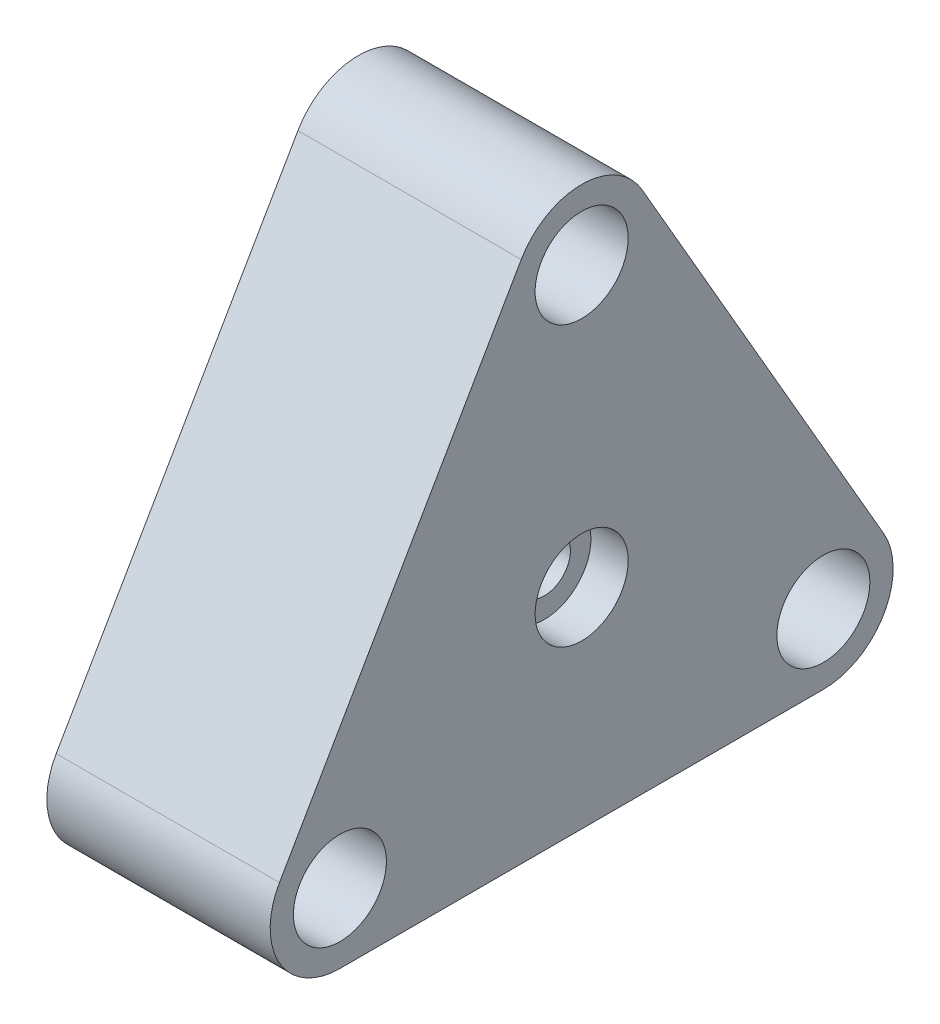
ISO-10303-21;
HEADER;
FILE_DESCRIPTION(('STEP AP214'),'2;1');
FILE_NAME('part.step','',(''),(''),'','','');
FILE_SCHEMA(('AUTOMOTIVE_DESIGN { 1 0 10303 214 1 1 1 1 }'));
ENDSEC;
DATA;
#1=APPLICATION_CONTEXT('core data for automotive mechanical design processes');
#2=APPLICATION_PROTOCOL_DEFINITION('international standard','automotive_design',2000,#1);
#3=PRODUCT_CONTEXT('',#1,'mechanical');
#4=PRODUCT('Part','Part','',(#3));
#5=PRODUCT_RELATED_PRODUCT_CATEGORY('part','',(#4));
#6=PRODUCT_DEFINITION_FORMATION('','',#4);
#7=PRODUCT_DEFINITION_CONTEXT('part definition',#1,'design');
#8=PRODUCT_DEFINITION('design','',#6,#7);
#9=PRODUCT_DEFINITION_SHAPE('','',#8);
#10=(LENGTH_UNIT() NAMED_UNIT(*) SI_UNIT(.MILLI.,.METRE.));
#11=(NAMED_UNIT(*) PLANE_ANGLE_UNIT() SI_UNIT($,.RADIAN.));
#12=(NAMED_UNIT(*) SI_UNIT($,.STERADIAN.) SOLID_ANGLE_UNIT());
#13=UNCERTAINTY_MEASURE_WITH_UNIT(LENGTH_MEASURE(1.E-05),#10,'distance_accuracy_value','');
#14=(GEOMETRIC_REPRESENTATION_CONTEXT(3) GLOBAL_UNCERTAINTY_ASSIGNED_CONTEXT((#13)) GLOBAL_UNIT_ASSIGNED_CONTEXT((#10,
#11,#12)) REPRESENTATION_CONTEXT('',''));
#15=CARTESIAN_POINT('',(0.,0.,0.));
#16=DIRECTION('',(0.,0.,1.));
#17=DIRECTION('',(1.,0.,0.));
#18=AXIS2_PLACEMENT_3D('',#15,#16,#17);
#19=CARTESIAN_POINT('',(0.,0.,0.));
#20=DIRECTION('',(-1.,0.,0.));
#21=DIRECTION('',(0.,0.,1.));
#22=AXIS2_PLACEMENT_3D('',#19,#20,#21);
#23=CYLINDRICAL_SURFACE('',#22,1.397);
#24=CARTESIAN_POINT('',(0.,0.,0.));
#25=DIRECTION('',(-1.,0.,0.));
#26=DIRECTION('',(0.,0.,1.));
#27=AXIS2_PLACEMENT_3D('',#24,#25,#26);
#28=CIRCLE('',#27,1.397);
#29=CARTESIAN_POINT('',(0.,0.,1.397));
#30=VERTEX_POINT('',#29);
#31=EDGE_CURVE('E179',#30,#30,#28,.T.);
#32=ORIENTED_EDGE('',*,*,#31,.T.);
#33=EDGE_LOOP('',(#32));
#34=FACE_BOUND('',#33,.T.);
#35=CARTESIAN_POINT('',(4.,0.,0.));
#36=DIRECTION('',(1.,0.,0.));
#37=DIRECTION('',(0.,0.,-1.));
#38=AXIS2_PLACEMENT_3D('',#35,#36,#37);
#39=CIRCLE('',#38,1.397);
#40=CARTESIAN_POINT('',(4.,0.,-1.397));
#41=VERTEX_POINT('',#40);
#42=EDGE_CURVE('E53',#41,#41,#39,.F.);
#43=ORIENTED_EDGE('',*,*,#42,.F.);
#44=EDGE_LOOP('',(#43));
#45=FACE_BOUND('',#44,.T.);
#46=ADVANCED_FACE('F49',(#34,#45),#23,.F.);
#47=CARTESIAN_POINT('',(0.,-7.49999999999997,12.9903810567666));
#48=DIRECTION('',(1.,0.,0.));
#49=DIRECTION('',(0.,0.,-1.));
#50=AXIS2_PLACEMENT_3D('',#47,#48,#49);
#51=CYLINDRICAL_SURFACE('',#50,1.397);
#52=CARTESIAN_POINT('',(0.,-7.49999999999997,12.9903810567666));
#53=DIRECTION('',(1.,0.,0.));
#54=DIRECTION('',(0.,0.,-1.));
#55=AXIS2_PLACEMENT_3D('',#52,#53,#54);
#56=CIRCLE('',#55,1.397);
#57=CARTESIAN_POINT('',(0.,-7.49999999999997,11.5933810567666));
#58=VERTEX_POINT('',#57);
#59=EDGE_CURVE('E199',#58,#58,#56,.T.);
#60=ORIENTED_EDGE('',*,*,#59,.T.);
#61=EDGE_LOOP('',(#60));
#62=FACE_BOUND('',#61,.T.);
#63=CARTESIAN_POINT('',(-4.,-7.49999999999997,12.9903810567666));
#64=DIRECTION('',(-1.,0.,0.));
#65=DIRECTION('',(0.,0.,1.));
#66=AXIS2_PLACEMENT_3D('',#63,#64,#65);
#67=CIRCLE('',#66,1.397);
#68=CARTESIAN_POINT('',(-4.,-7.49999999999997,14.3873810567666));
#69=VERTEX_POINT('',#68);
#70=EDGE_CURVE('E176',#69,#69,#67,.F.);
#71=ORIENTED_EDGE('',*,*,#70,.F.);
#72=EDGE_LOOP('',(#71));
#73=FACE_BOUND('',#72,.T.);
#74=ADVANCED_FACE('F260',(#62,#73),#51,.F.);
#75=CARTESIAN_POINT('',(0.,15.,0.));
#76=DIRECTION('',(1.,0.,0.));
#77=DIRECTION('',(0.,0.,-1.));
#78=AXIS2_PLACEMENT_3D('',#75,#76,#77);
#79=CYLINDRICAL_SURFACE('',#78,1.397);
#80=CARTESIAN_POINT('',(0.,15.,0.));
#81=DIRECTION('',(1.,0.,0.));
#82=DIRECTION('',(0.,0.,-1.));
#83=AXIS2_PLACEMENT_3D('',#80,#81,#82);
#84=CIRCLE('',#83,1.397);
#85=CARTESIAN_POINT('',(0.,15.,-1.397));
#86=VERTEX_POINT('',#85);
#87=EDGE_CURVE('E190',#86,#86,#84,.T.);
#88=ORIENTED_EDGE('',*,*,#87,.T.);
#89=EDGE_LOOP('',(#88));
#90=FACE_BOUND('',#89,.T.);
#91=CARTESIAN_POINT('',(-4.,15.,0.));
#92=DIRECTION('',(-1.,0.,0.));
#93=DIRECTION('',(0.,0.,1.));
#94=AXIS2_PLACEMENT_3D('',#91,#92,#93);
#95=CIRCLE('',#94,1.397);
#96=CARTESIAN_POINT('',(-4.,15.,1.397));
#97=VERTEX_POINT('',#96);
#98=EDGE_CURVE('E172',#97,#97,#95,.F.);
#99=ORIENTED_EDGE('',*,*,#98,.F.);
#100=EDGE_LOOP('',(#99));
#101=FACE_BOUND('',#100,.T.);
#102=ADVANCED_FACE('F265',(#90,#101),#79,.F.);
#103=CARTESIAN_POINT('',(0.,-7.49999999999997,-12.9903810567666));
#104=DIRECTION('',(1.,0.,0.));
#105=DIRECTION('',(0.,0.,-1.));
#106=AXIS2_PLACEMENT_3D('',#103,#104,#105);
#107=CYLINDRICAL_SURFACE('',#106,1.397);
#108=CARTESIAN_POINT('',(0.,-7.49999999999997,-12.9903810567666));
#109=DIRECTION('',(1.,0.,0.));
#110=DIRECTION('',(0.,0.,-1.));
#111=AXIS2_PLACEMENT_3D('',#108,#109,#110);
#112=CIRCLE('',#111,1.397);
#113=CARTESIAN_POINT('',(0.,-7.49999999999997,-14.3873810567666));
#114=VERTEX_POINT('',#113);
#115=EDGE_CURVE('E184',#114,#114,#112,.T.);
#116=ORIENTED_EDGE('',*,*,#115,.T.);
#117=EDGE_LOOP('',(#116));
#118=FACE_BOUND('',#117,.T.);
#119=CARTESIAN_POINT('',(-4.,-7.49999999999997,-12.9903810567666));
#120=DIRECTION('',(-1.,0.,0.));
#121=DIRECTION('',(0.,0.,1.));
#122=AXIS2_PLACEMENT_3D('',#119,#120,#121);
#123=CIRCLE('',#122,1.397);
#124=CARTESIAN_POINT('',(-4.,-7.49999999999997,-11.5933810567666));
#125=VERTEX_POINT('',#124);
#126=EDGE_CURVE('E168',#125,#125,#123,.F.);
#127=ORIENTED_EDGE('',*,*,#126,.F.);
#128=EDGE_LOOP('',(#127));
#129=FACE_BOUND('',#128,.T.);
#130=ADVANCED_FACE('F273',(#118,#129),#107,.F.);
#131=CARTESIAN_POINT('',(6.,-7.49999999999997,12.9903810567666));
#132=DIRECTION('',(-1.,0.,0.));
#133=DIRECTION('',(0.,0.,1.));
#134=AXIS2_PLACEMENT_3D('',#131,#132,#133);
#135=CYLINDRICAL_SURFACE('',#134,3.75);
#136=CARTESIAN_POINT('',(-6.,-7.49999999999997,12.9903810567666));
#137=DIRECTION('',(1.,0.,0.));
#138=DIRECTION('',(0.,0.,-1.));
#139=AXIS2_PLACEMENT_3D('',#136,#137,#138);
#140=CIRCLE('',#139,3.75);
#141=CARTESIAN_POINT('',(-6.,-5.62499999999997,16.2379763209582));
#142=VERTEX_POINT('',#141);
#143=CARTESIAN_POINT('',(-6.,-11.25,12.9903810567666));
#144=VERTEX_POINT('',#143);
#145=EDGE_CURVE('E141',#142,#144,#140,.T.);
#146=ORIENTED_EDGE('',*,*,#145,.T.);
#147=DIRECTION('',(-1.,0.,0.));
#148=VECTOR('',#147,1.);
#149=CARTESIAN_POINT('',(6.,-11.25,12.9903810567666));
#150=LINE('',#149,#148);
#151=CARTESIAN_POINT('',(6.,-11.25,12.9903810567666));
#152=VERTEX_POINT('',#151);
#153=EDGE_CURVE('E12',#152,#144,#150,.T.);
#154=ORIENTED_EDGE('',*,*,#153,.F.);
#155=CARTESIAN_POINT('',(6.,-7.49999999999997,12.9903810567666));
#156=DIRECTION('',(1.,0.,0.));
#157=DIRECTION('',(0.,0.,-1.));
#158=AXIS2_PLACEMENT_3D('',#155,#156,#157);
#159=CIRCLE('',#158,3.75);
#160=CARTESIAN_POINT('',(6.,-5.62499999999997,16.2379763209582));
#161=VERTEX_POINT('',#160);
#162=EDGE_CURVE('E158',#161,#152,#159,.T.);
#163=ORIENTED_EDGE('',*,*,#162,.F.);
#164=DIRECTION('',(-1.,0.,0.));
#165=VECTOR('',#164,1.);
#166=CARTESIAN_POINT('',(6.,-5.62499999999997,16.2379763209582));
#167=LINE('',#166,#165);
#168=EDGE_CURVE('E137',#161,#142,#167,.T.);
#169=ORIENTED_EDGE('',*,*,#168,.T.);
#170=EDGE_LOOP('',(#146,#154,#163,#169));
#171=FACE_BOUND('',#170,.T.);
#172=ADVANCED_FACE('F51',(#171),#135,.T.);
#173=CARTESIAN_POINT('',(6.,-11.25,12.9903810567666));
#174=DIRECTION('',(0.,1.,0.));
#175=DIRECTION('',(0.,0.,1.));
#176=AXIS2_PLACEMENT_3D('',#173,#174,#175);
#177=PLANE('',#176);
#178=DIRECTION('',(0.,0.,-1.));
#179=VECTOR('',#178,1.);
#180=CARTESIAN_POINT('',(-6.,-11.25,12.9903810567666));
#181=LINE('',#180,#179);
#182=CARTESIAN_POINT('',(-6.,-11.25,-12.9903810567666));
#183=VERTEX_POINT('',#182);
#184=EDGE_CURVE('E145',#144,#183,#181,.T.);
#185=ORIENTED_EDGE('',*,*,#184,.T.);
#186=DIRECTION('',(-1.,0.,0.));
#187=VECTOR('',#186,1.);
#188=CARTESIAN_POINT('',(6.,-11.25,-12.9903810567666));
#189=LINE('',#188,#187);
#190=CARTESIAN_POINT('',(6.,-11.25,-12.9903810567666));
#191=VERTEX_POINT('',#190);
#192=EDGE_CURVE('E60',#191,#183,#189,.T.);
#193=ORIENTED_EDGE('',*,*,#192,.F.);
#194=DIRECTION('',(0.,0.,-1.));
#195=VECTOR('',#194,1.);
#196=CARTESIAN_POINT('',(6.,-11.25,12.9903810567666));
#197=LINE('',#196,#195);
#198=EDGE_CURVE('E106',#152,#191,#197,.T.);
#199=ORIENTED_EDGE('',*,*,#198,.F.);
#200=ORIENTED_EDGE('',*,*,#153,.T.);
#201=EDGE_LOOP('',(#185,#193,#199,#200));
#202=FACE_BOUND('',#201,.T.);
#203=ADVANCED_FACE('F240',(#202),#177,.F.);
#204=CARTESIAN_POINT('',(6.,-7.49999999999997,-12.9903810567666));
#205=DIRECTION('',(-1.,0.,0.));
#206=DIRECTION('',(0.,0.,1.));
#207=AXIS2_PLACEMENT_3D('',#204,#205,#206);
#208=CYLINDRICAL_SURFACE('',#207,3.75);
#209=CARTESIAN_POINT('',(-6.,-7.49999999999997,-12.9903810567666));
#210=DIRECTION('',(1.,0.,0.));
#211=DIRECTION('',(0.,0.,-1.));
#212=AXIS2_PLACEMENT_3D('',#209,#210,#211);
#213=CIRCLE('',#212,3.75);
#214=CARTESIAN_POINT('',(-6.,-5.62499999999997,-16.2379763209582));
#215=VERTEX_POINT('',#214);
#216=EDGE_CURVE('E149',#183,#215,#213,.T.);
#217=ORIENTED_EDGE('',*,*,#216,.T.);
#218=DIRECTION('',(-1.,0.,0.));
#219=VECTOR('',#218,1.);
#220=CARTESIAN_POINT('',(6.,-5.62499999999997,-16.2379763209582));
#221=LINE('',#220,#219);
#222=CARTESIAN_POINT('',(6.,-5.62499999999997,-16.2379763209582));
#223=VERTEX_POINT('',#222);
#224=EDGE_CURVE('E130',#223,#215,#221,.T.);
#225=ORIENTED_EDGE('',*,*,#224,.F.);
#226=CARTESIAN_POINT('',(6.,-7.49999999999997,-12.9903810567666));
#227=DIRECTION('',(1.,0.,0.));
#228=DIRECTION('',(0.,0.,-1.));
#229=AXIS2_PLACEMENT_3D('',#226,#227,#228);
#230=CIRCLE('',#229,3.75);
#231=EDGE_CURVE('E119',#191,#223,#230,.T.);
#232=ORIENTED_EDGE('',*,*,#231,.F.);
#233=ORIENTED_EDGE('',*,*,#192,.T.);
#234=EDGE_LOOP('',(#217,#225,#232,#233));
#235=FACE_BOUND('',#234,.T.);
#236=ADVANCED_FACE('F243',(#235),#208,.T.);
#237=CARTESIAN_POINT('',(6.,16.875,-3.24759526419164));
#238=DIRECTION('',(0.,-0.500000000000001,0.866025403784438));
#239=DIRECTION('',(0.,-0.866025403784438,-0.500000000000001));
#240=AXIS2_PLACEMENT_3D('',#237,#238,#239);
#241=PLANE('',#240);
#242=DIRECTION('',(0.,0.866025403784438,0.500000000000001));
#243=VECTOR('',#242,1.);
#244=CARTESIAN_POINT('',(-6.,16.875,-3.24759526419164));
#245=LINE('',#244,#243);
#246=CARTESIAN_POINT('',(-6.,16.875,-3.24759526419164));
#247=VERTEX_POINT('',#246);
#248=EDGE_CURVE('E128',#215,#247,#245,.T.);
#249=ORIENTED_EDGE('',*,*,#248,.T.);
#250=DIRECTION('',(-1.,0.,0.));
#251=VECTOR('',#250,1.);
#252=CARTESIAN_POINT('',(6.,16.875,-3.24759526419164));
#253=LINE('',#252,#251);
#254=CARTESIAN_POINT('',(6.,16.875,-3.24759526419164));
#255=VERTEX_POINT('',#254);
#256=EDGE_CURVE('E125',#255,#247,#253,.T.);
#257=ORIENTED_EDGE('',*,*,#256,.F.);
#258=DIRECTION('',(0.,0.866025403784438,0.500000000000001));
#259=VECTOR('',#258,1.);
#260=CARTESIAN_POINT('',(6.,16.875,-3.24759526419164));
#261=LINE('',#260,#259);
#262=EDGE_CURVE('E113',#223,#255,#261,.T.);
#263=ORIENTED_EDGE('',*,*,#262,.F.);
#264=ORIENTED_EDGE('',*,*,#224,.T.);
#265=EDGE_LOOP('',(#249,#257,#263,#264));
#266=FACE_BOUND('',#265,.T.);
#267=ADVANCED_FACE('F126',(#266),#241,.F.);
#268=CARTESIAN_POINT('',(6.,15.,0.));
#269=DIRECTION('',(-1.,0.,0.));
#270=DIRECTION('',(0.,0.,1.));
#271=AXIS2_PLACEMENT_3D('',#268,#269,#270);
#272=CYLINDRICAL_SURFACE('',#271,3.75);
#273=CARTESIAN_POINT('',(-6.,15.,0.));
#274=DIRECTION('',(1.,0.,0.));
#275=DIRECTION('',(0.,0.,-1.));
#276=AXIS2_PLACEMENT_3D('',#273,#274,#275);
#277=CIRCLE('',#276,3.75);
#278=CARTESIAN_POINT('',(-6.,16.875,3.24759526419164));
#279=VERTEX_POINT('',#278);
#280=EDGE_CURVE('E92',#247,#279,#277,.T.);
#281=ORIENTED_EDGE('',*,*,#280,.T.);
#282=DIRECTION('',(-1.,0.,0.));
#283=VECTOR('',#282,1.);
#284=CARTESIAN_POINT('',(6.,16.875,3.24759526419164));
#285=LINE('',#284,#283);
#286=CARTESIAN_POINT('',(6.,16.875,3.24759526419164));
#287=VERTEX_POINT('',#286);
#288=EDGE_CURVE('E131',#287,#279,#285,.T.);
#289=ORIENTED_EDGE('',*,*,#288,.F.);
#290=CARTESIAN_POINT('',(6.,15.,0.));
#291=DIRECTION('',(1.,0.,0.));
#292=DIRECTION('',(0.,0.,-1.));
#293=AXIS2_PLACEMENT_3D('',#290,#291,#292);
#294=CIRCLE('',#293,3.75);
#295=EDGE_CURVE('E117',#255,#287,#294,.T.);
#296=ORIENTED_EDGE('',*,*,#295,.F.);
#297=ORIENTED_EDGE('',*,*,#256,.T.);
#298=EDGE_LOOP('',(#281,#289,#296,#297));
#299=FACE_BOUND('',#298,.T.);
#300=ADVANCED_FACE('F133',(#299),#272,.T.);
#301=CARTESIAN_POINT('',(6.,-5.62499999999997,16.2379763209582));
#302=DIRECTION('',(0.,-0.500000000000001,-0.866025403784438));
#303=DIRECTION('',(0.,0.866025403784438,-0.500000000000001));
#304=AXIS2_PLACEMENT_3D('',#301,#302,#303);
#305=PLANE('',#304);
#306=DIRECTION('',(0.,-0.866025403784438,0.500000000000001));
#307=VECTOR('',#306,1.);
#308=CARTESIAN_POINT('',(-6.,-5.62499999999997,16.2379763209582));
#309=LINE('',#308,#307);
#310=EDGE_CURVE('E98',#279,#142,#309,.T.);
#311=ORIENTED_EDGE('',*,*,#310,.T.);
#312=ORIENTED_EDGE('',*,*,#168,.F.);
#313=DIRECTION('',(0.,-0.866025403784438,0.500000000000001));
#314=VECTOR('',#313,1.);
#315=CARTESIAN_POINT('',(6.,-5.62499999999997,16.2379763209582));
#316=LINE('',#315,#314);
#317=EDGE_CURVE('E69',#287,#161,#316,.T.);
#318=ORIENTED_EDGE('',*,*,#317,.F.);
#319=ORIENTED_EDGE('',*,*,#288,.T.);
#320=EDGE_LOOP('',(#311,#312,#318,#319));
#321=FACE_BOUND('',#320,.T.);
#322=ADVANCED_FACE('F248',(#321),#305,.F.);
#323=CARTESIAN_POINT('',(6.,-7.49999999999997,12.9903810567666));
#324=DIRECTION('',(1.,0.,0.));
#325=DIRECTION('',(0.,0.,-1.));
#326=AXIS2_PLACEMENT_3D('',#323,#324,#325);
#327=PLANE('',#326);
#328=CARTESIAN_POINT('',(6.,0.,0.));
#329=DIRECTION('',(1.,0.,0.));
#330=DIRECTION('',(0.,0.,-1.));
#331=AXIS2_PLACEMENT_3D('',#328,#329,#330);
#332=CIRCLE('',#331,2.5);
#333=CARTESIAN_POINT('',(6.,0.,-2.5));
#334=VERTEX_POINT('',#333);
#335=EDGE_CURVE('E346',#334,#334,#332,.T.);
#336=ORIENTED_EDGE('',*,*,#335,.F.);
#337=EDGE_LOOP('',(#336));
#338=FACE_BOUND('',#337,.T.);
#339=CARTESIAN_POINT('',(6.,15.,0.));
#340=DIRECTION('',(1.,0.,0.));
#341=DIRECTION('',(0.,0.,-1.));
#342=AXIS2_PLACEMENT_3D('',#339,#340,#341);
#343=CIRCLE('',#342,2.5);
#344=CARTESIAN_POINT('',(6.,15.,-2.5));
#345=VERTEX_POINT('',#344);
#346=EDGE_CURVE('E215',#345,#345,#343,.T.);
#347=ORIENTED_EDGE('',*,*,#346,.F.);
#348=EDGE_LOOP('',(#347));
#349=FACE_BOUND('',#348,.T.);
#350=CARTESIAN_POINT('',(6.,-7.49999999999997,12.9903810567666));
#351=DIRECTION('',(1.,0.,0.));
#352=DIRECTION('',(0.,0.,-1.));
#353=AXIS2_PLACEMENT_3D('',#350,#351,#352);
#354=CIRCLE('',#353,2.5);
#355=CARTESIAN_POINT('',(6.,-7.49999999999997,10.4903810567666));
#356=VERTEX_POINT('',#355);
#357=EDGE_CURVE('E219',#356,#356,#354,.T.);
#358=ORIENTED_EDGE('',*,*,#357,.F.);
#359=EDGE_LOOP('',(#358));
#360=FACE_BOUND('',#359,.T.);
#361=CARTESIAN_POINT('',(6.,-7.49999999999997,-12.9903810567666));
#362=DIRECTION('',(1.,0.,0.));
#363=DIRECTION('',(0.,0.,-1.));
#364=AXIS2_PLACEMENT_3D('',#361,#362,#363);
#365=CIRCLE('',#364,2.5);
#366=CARTESIAN_POINT('',(6.,-7.49999999999997,-15.4903810567666));
#367=VERTEX_POINT('',#366);
#368=EDGE_CURVE('E227',#367,#367,#365,.T.);
#369=ORIENTED_EDGE('',*,*,#368,.F.);
#370=EDGE_LOOP('',(#369));
#371=FACE_BOUND('',#370,.T.);
#372=ORIENTED_EDGE('',*,*,#162,.T.);
#373=ORIENTED_EDGE('',*,*,#198,.T.);
#374=ORIENTED_EDGE('',*,*,#231,.T.);
#375=ORIENTED_EDGE('',*,*,#262,.T.);
#376=ORIENTED_EDGE('',*,*,#295,.T.);
#377=ORIENTED_EDGE('',*,*,#317,.T.);
#378=EDGE_LOOP('',(#372,#373,#374,#375,#376,#377));
#379=FACE_BOUND('',#378,.T.);
#380=ADVANCED_FACE('F115',(#338,#349,#360,#371,#379),#327,.T.);
#381=CARTESIAN_POINT('',(-6.,-7.49999999999997,12.9903810567666));
#382=DIRECTION('',(1.,0.,0.));
#383=DIRECTION('',(0.,0.,-1.));
#384=AXIS2_PLACEMENT_3D('',#381,#382,#383);
#385=PLANE('',#384);
#386=CARTESIAN_POINT('',(-6.,15.,0.));
#387=DIRECTION('',(-1.,0.,0.));
#388=DIRECTION('',(0.,0.,1.));
#389=AXIS2_PLACEMENT_3D('',#386,#387,#388);
#390=CIRCLE('',#389,2.5);
#391=CARTESIAN_POINT('',(-6.,15.,2.5));
#392=VERTEX_POINT('',#391);
#393=EDGE_CURVE('E319',#392,#392,#390,.T.);
#394=ORIENTED_EDGE('',*,*,#393,.F.);
#395=EDGE_LOOP('',(#394));
#396=FACE_BOUND('',#395,.T.);
#397=CARTESIAN_POINT('',(-6.,-7.49999999999997,-12.9903810567666));
#398=DIRECTION('',(-1.,0.,0.));
#399=DIRECTION('',(0.,0.,1.));
#400=AXIS2_PLACEMENT_3D('',#397,#398,#399);
#401=CIRCLE('',#400,2.5);
#402=CARTESIAN_POINT('',(-6.,-7.49999999999997,-10.4903810567666));
#403=VERTEX_POINT('',#402);
#404=EDGE_CURVE('E323',#403,#403,#401,.T.);
#405=ORIENTED_EDGE('',*,*,#404,.F.);
#406=EDGE_LOOP('',(#405));
#407=FACE_BOUND('',#406,.T.);
#408=CARTESIAN_POINT('',(-6.,-7.49999999999997,12.9903810567666));
#409=DIRECTION('',(-1.,0.,0.));
#410=DIRECTION('',(0.,0.,1.));
#411=AXIS2_PLACEMENT_3D('',#408,#409,#410);
#412=CIRCLE('',#411,2.5);
#413=CARTESIAN_POINT('',(-6.,-7.49999999999997,15.4903810567666));
#414=VERTEX_POINT('',#413);
#415=EDGE_CURVE('E327',#414,#414,#412,.T.);
#416=ORIENTED_EDGE('',*,*,#415,.F.);
#417=EDGE_LOOP('',(#416));
#418=FACE_BOUND('',#417,.T.);
#419=CARTESIAN_POINT('',(-6.,0.,0.));
#420=DIRECTION('',(-1.,0.,0.));
#421=DIRECTION('',(0.,0.,1.));
#422=AXIS2_PLACEMENT_3D('',#419,#420,#421);
#423=CIRCLE('',#422,2.5);
#424=CARTESIAN_POINT('',(-6.,0.,2.5));
#425=VERTEX_POINT('',#424);
#426=EDGE_CURVE('E203',#425,#425,#423,.T.);
#427=ORIENTED_EDGE('',*,*,#426,.F.);
#428=EDGE_LOOP('',(#427));
#429=FACE_BOUND('',#428,.T.);
#430=ORIENTED_EDGE('',*,*,#145,.F.);
#431=ORIENTED_EDGE('',*,*,#310,.F.);
#432=ORIENTED_EDGE('',*,*,#280,.F.);
#433=ORIENTED_EDGE('',*,*,#248,.F.);
#434=ORIENTED_EDGE('',*,*,#216,.F.);
#435=ORIENTED_EDGE('',*,*,#184,.F.);
#436=EDGE_LOOP('',(#430,#431,#432,#433,#434,#435));
#437=FACE_BOUND('',#436,.T.);
#438=ADVANCED_FACE('F246',(#396,#407,#418,#429,#437),#385,.F.);
#439=CARTESIAN_POINT('',(0.,-7.49999999999997,-12.9903810567666));
#440=DIRECTION('',(1.,0.,0.));
#441=DIRECTION('',(0.,0.,-1.));
#442=AXIS2_PLACEMENT_3D('',#439,#440,#441);
#443=CYLINDRICAL_SURFACE('',#442,2.5);
#444=CARTESIAN_POINT('',(0.,-7.49999999999997,-12.9903810567666));
#445=DIRECTION('',(1.,0.,0.));
#446=DIRECTION('',(0.,0.,-1.));
#447=AXIS2_PLACEMENT_3D('',#444,#445,#446);
#448=CIRCLE('',#447,2.5);
#449=CARTESIAN_POINT('',(0.,-7.49999999999997,-15.4903810567666));
#450=VERTEX_POINT('',#449);
#451=EDGE_CURVE('E208',#450,#450,#448,.T.);
#452=ORIENTED_EDGE('',*,*,#451,.F.);
#453=EDGE_LOOP('',(#452));
#454=FACE_BOUND('',#453,.T.);
#455=ORIENTED_EDGE('',*,*,#368,.T.);
#456=EDGE_LOOP('',(#455));
#457=FACE_BOUND('',#456,.T.);
#458=ADVANCED_FACE('F306',(#454,#457),#443,.F.);
#459=CARTESIAN_POINT('',(0.,-7.49999999999997,-12.9903810567666));
#460=DIRECTION('',(1.,0.,0.));
#461=DIRECTION('',(0.,0.,-1.));
#462=AXIS2_PLACEMENT_3D('',#459,#460,#461);
#463=PLANE('',#462);
#464=ORIENTED_EDGE('',*,*,#115,.F.);
#465=EDGE_LOOP('',(#464));
#466=FACE_BOUND('',#465,.T.);
#467=ORIENTED_EDGE('',*,*,#451,.T.);
#468=EDGE_LOOP('',(#467));
#469=FACE_BOUND('',#468,.T.);
#470=ADVANCED_FACE('F301',(#466,#469),#463,.T.);
#471=CARTESIAN_POINT('',(0.,-7.49999999999997,12.9903810567666));
#472=DIRECTION('',(1.,0.,0.));
#473=DIRECTION('',(0.,0.,-1.));
#474=AXIS2_PLACEMENT_3D('',#471,#472,#473);
#475=CYLINDRICAL_SURFACE('',#474,2.5);
#476=CARTESIAN_POINT('',(0.,-7.49999999999997,12.9903810567666));
#477=DIRECTION('',(1.,0.,0.));
#478=DIRECTION('',(0.,0.,-1.));
#479=AXIS2_PLACEMENT_3D('',#476,#477,#478);
#480=CIRCLE('',#479,2.5);
#481=CARTESIAN_POINT('',(0.,-7.49999999999997,10.4903810567666));
#482=VERTEX_POINT('',#481);
#483=EDGE_CURVE('E223',#482,#482,#480,.T.);
#484=ORIENTED_EDGE('',*,*,#483,.F.);
#485=EDGE_LOOP('',(#484));
#486=FACE_BOUND('',#485,.T.);
#487=ORIENTED_EDGE('',*,*,#357,.T.);
#488=EDGE_LOOP('',(#487));
#489=FACE_BOUND('',#488,.T.);
#490=ADVANCED_FACE('F298',(#486,#489),#475,.F.);
#491=CARTESIAN_POINT('',(0.,-7.49999999999997,12.9903810567666));
#492=DIRECTION('',(1.,0.,0.));
#493=DIRECTION('',(0.,0.,-1.));
#494=AXIS2_PLACEMENT_3D('',#491,#492,#493);
#495=PLANE('',#494);
#496=ORIENTED_EDGE('',*,*,#59,.F.);
#497=EDGE_LOOP('',(#496));
#498=FACE_BOUND('',#497,.T.);
#499=ORIENTED_EDGE('',*,*,#483,.T.);
#500=EDGE_LOOP('',(#499));
#501=FACE_BOUND('',#500,.T.);
#502=ADVANCED_FACE('F296',(#498,#501),#495,.T.);
#503=CARTESIAN_POINT('',(0.,15.,0.));
#504=DIRECTION('',(1.,0.,0.));
#505=DIRECTION('',(0.,0.,-1.));
#506=AXIS2_PLACEMENT_3D('',#503,#504,#505);
#507=CYLINDRICAL_SURFACE('',#506,2.5);
#508=CARTESIAN_POINT('',(0.,15.,0.));
#509=DIRECTION('',(1.,0.,0.));
#510=DIRECTION('',(0.,0.,-1.));
#511=AXIS2_PLACEMENT_3D('',#508,#509,#510);
#512=CIRCLE('',#511,2.5);
#513=CARTESIAN_POINT('',(0.,15.,-2.5));
#514=VERTEX_POINT('',#513);
#515=EDGE_CURVE('E146',#514,#514,#512,.T.);
#516=ORIENTED_EDGE('',*,*,#515,.F.);
#517=EDGE_LOOP('',(#516));
#518=FACE_BOUND('',#517,.T.);
#519=ORIENTED_EDGE('',*,*,#346,.T.);
#520=EDGE_LOOP('',(#519));
#521=FACE_BOUND('',#520,.T.);
#522=ADVANCED_FACE('F292',(#518,#521),#507,.F.);
#523=CARTESIAN_POINT('',(0.,15.,0.));
#524=DIRECTION('',(1.,0.,0.));
#525=DIRECTION('',(0.,0.,-1.));
#526=AXIS2_PLACEMENT_3D('',#523,#524,#525);
#527=PLANE('',#526);
#528=ORIENTED_EDGE('',*,*,#87,.F.);
#529=EDGE_LOOP('',(#528));
#530=FACE_BOUND('',#529,.T.);
#531=ORIENTED_EDGE('',*,*,#515,.T.);
#532=EDGE_LOOP('',(#531));
#533=FACE_BOUND('',#532,.T.);
#534=ADVANCED_FACE('F288',(#530,#533),#527,.T.);
#535=CARTESIAN_POINT('',(0.,0.,0.));
#536=DIRECTION('',(-1.,0.,0.));
#537=DIRECTION('',(0.,0.,1.));
#538=AXIS2_PLACEMENT_3D('',#535,#536,#537);
#539=CYLINDRICAL_SURFACE('',#538,2.5);
#540=CARTESIAN_POINT('',(0.,0.,0.));
#541=DIRECTION('',(-1.,0.,0.));
#542=DIRECTION('',(0.,0.,1.));
#543=AXIS2_PLACEMENT_3D('',#540,#541,#542);
#544=CIRCLE('',#543,2.5);
#545=CARTESIAN_POINT('',(0.,0.,2.5));
#546=VERTEX_POINT('',#545);
#547=EDGE_CURVE('E204',#546,#546,#544,.T.);
#548=ORIENTED_EDGE('',*,*,#547,.F.);
#549=EDGE_LOOP('',(#548));
#550=FACE_BOUND('',#549,.T.);
#551=ORIENTED_EDGE('',*,*,#426,.T.);
#552=EDGE_LOOP('',(#551));
#553=FACE_BOUND('',#552,.T.);
#554=ADVANCED_FACE('F284',(#550,#553),#539,.F.);
#555=CARTESIAN_POINT('',(0.,0.,0.));
#556=DIRECTION('',(-1.,0.,0.));
#557=DIRECTION('',(0.,0.,1.));
#558=AXIS2_PLACEMENT_3D('',#555,#556,#557);
#559=PLANE('',#558);
#560=ORIENTED_EDGE('',*,*,#31,.F.);
#561=EDGE_LOOP('',(#560));
#562=FACE_BOUND('',#561,.T.);
#563=ORIENTED_EDGE('',*,*,#547,.T.);
#564=EDGE_LOOP('',(#563));
#565=FACE_BOUND('',#564,.T.);
#566=ADVANCED_FACE('F280',(#562,#565),#559,.T.);
#567=CARTESIAN_POINT('',(-4.,-7.49999999999997,-12.9903810567666));
#568=DIRECTION('',(-1.,0.,0.));
#569=DIRECTION('',(0.,0.,1.));
#570=AXIS2_PLACEMENT_3D('',#567,#568,#569);
#571=PLANE('',#570);
#572=CARTESIAN_POINT('',(-4.,-7.49999999999997,-12.9903810567666));
#573=DIRECTION('',(-1.,0.,0.));
#574=DIRECTION('',(0.,0.,1.));
#575=AXIS2_PLACEMENT_3D('',#572,#573,#574);
#576=CIRCLE('',#575,2.5);
#577=CARTESIAN_POINT('',(-4.,-7.49999999999997,-10.4903810567666));
#578=VERTEX_POINT('',#577);
#579=EDGE_CURVE('E332',#578,#578,#576,.T.);
#580=ORIENTED_EDGE('',*,*,#579,.T.);
#581=EDGE_LOOP('',(#580));
#582=FACE_BOUND('',#581,.T.);
#583=ORIENTED_EDGE('',*,*,#126,.T.);
#584=EDGE_LOOP('',(#583));
#585=FACE_BOUND('',#584,.T.);
#586=ADVANCED_FACE('F283',(#582,#585),#571,.T.);
#587=CARTESIAN_POINT('',(-4.,-7.49999999999997,-12.9903810567666));
#588=DIRECTION('',(-1.,0.,0.));
#589=DIRECTION('',(0.,0.,1.));
#590=AXIS2_PLACEMENT_3D('',#587,#588,#589);
#591=CYLINDRICAL_SURFACE('',#590,2.5);
#592=ORIENTED_EDGE('',*,*,#579,.F.);
#593=EDGE_LOOP('',(#592));
#594=FACE_BOUND('',#593,.T.);
#595=ORIENTED_EDGE('',*,*,#404,.T.);
#596=EDGE_LOOP('',(#595));
#597=FACE_BOUND('',#596,.T.);
#598=ADVANCED_FACE('F376',(#594,#597),#591,.F.);
#599=CARTESIAN_POINT('',(-4.,15.,0.));
#600=DIRECTION('',(-1.,0.,0.));
#601=DIRECTION('',(0.,0.,1.));
#602=AXIS2_PLACEMENT_3D('',#599,#600,#601);
#603=PLANE('',#602);
#604=CARTESIAN_POINT('',(-4.,15.,0.));
#605=DIRECTION('',(-1.,0.,0.));
#606=DIRECTION('',(0.,0.,1.));
#607=AXIS2_PLACEMENT_3D('',#604,#605,#606);
#608=CIRCLE('',#607,2.5);
#609=CARTESIAN_POINT('',(-4.,15.,2.5));
#610=VERTEX_POINT('',#609);
#611=EDGE_CURVE('E173',#610,#610,#608,.T.);
#612=ORIENTED_EDGE('',*,*,#611,.T.);
#613=EDGE_LOOP('',(#612));
#614=FACE_BOUND('',#613,.T.);
#615=ORIENTED_EDGE('',*,*,#98,.T.);
#616=EDGE_LOOP('',(#615));
#617=FACE_BOUND('',#616,.T.);
#618=ADVANCED_FACE('F372',(#614,#617),#603,.T.);
#619=CARTESIAN_POINT('',(-4.,15.,0.));
#620=DIRECTION('',(-1.,0.,0.));
#621=DIRECTION('',(0.,0.,1.));
#622=AXIS2_PLACEMENT_3D('',#619,#620,#621);
#623=CYLINDRICAL_SURFACE('',#622,2.5);
#624=ORIENTED_EDGE('',*,*,#611,.F.);
#625=EDGE_LOOP('',(#624));
#626=FACE_BOUND('',#625,.T.);
#627=ORIENTED_EDGE('',*,*,#393,.T.);
#628=EDGE_LOOP('',(#627));
#629=FACE_BOUND('',#628,.T.);
#630=ADVANCED_FACE('F375',(#626,#629),#623,.F.);
#631=CARTESIAN_POINT('',(-4.,-7.49999999999997,12.9903810567666));
#632=DIRECTION('',(-1.,0.,0.));
#633=DIRECTION('',(0.,0.,1.));
#634=AXIS2_PLACEMENT_3D('',#631,#632,#633);
#635=PLANE('',#634);
#636=CARTESIAN_POINT('',(-4.,-7.49999999999997,12.9903810567666));
#637=DIRECTION('',(-1.,0.,0.));
#638=DIRECTION('',(0.,0.,1.));
#639=AXIS2_PLACEMENT_3D('',#636,#637,#638);
#640=CIRCLE('',#639,2.5);
#641=CARTESIAN_POINT('',(-4.,-7.49999999999997,15.4903810567666));
#642=VERTEX_POINT('',#641);
#643=EDGE_CURVE('E193',#642,#642,#640,.T.);
#644=ORIENTED_EDGE('',*,*,#643,.T.);
#645=EDGE_LOOP('',(#644));
#646=FACE_BOUND('',#645,.T.);
#647=ORIENTED_EDGE('',*,*,#70,.T.);
#648=EDGE_LOOP('',(#647));
#649=FACE_BOUND('',#648,.T.);
#650=ADVANCED_FACE('F271',(#646,#649),#635,.T.);
#651=CARTESIAN_POINT('',(-4.,-7.49999999999997,12.9903810567666));
#652=DIRECTION('',(-1.,0.,0.));
#653=DIRECTION('',(0.,0.,1.));
#654=AXIS2_PLACEMENT_3D('',#651,#652,#653);
#655=CYLINDRICAL_SURFACE('',#654,2.5);
#656=ORIENTED_EDGE('',*,*,#643,.F.);
#657=EDGE_LOOP('',(#656));
#658=FACE_BOUND('',#657,.T.);
#659=ORIENTED_EDGE('',*,*,#415,.T.);
#660=EDGE_LOOP('',(#659));
#661=FACE_BOUND('',#660,.T.);
#662=ADVANCED_FACE('F362',(#658,#661),#655,.F.);
#663=CARTESIAN_POINT('',(4.,0.,0.));
#664=DIRECTION('',(1.,0.,0.));
#665=DIRECTION('',(0.,0.,-1.));
#666=AXIS2_PLACEMENT_3D('',#663,#664,#665);
#667=PLANE('',#666);
#668=CARTESIAN_POINT('',(4.,0.,0.));
#669=DIRECTION('',(1.,0.,0.));
#670=DIRECTION('',(0.,0.,-1.));
#671=AXIS2_PLACEMENT_3D('',#668,#669,#670);
#672=CIRCLE('',#671,2.5);
#673=CARTESIAN_POINT('',(4.,0.,-2.5));
#674=VERTEX_POINT('',#673);
#675=EDGE_CURVE('E350',#674,#674,#672,.T.);
#676=ORIENTED_EDGE('',*,*,#675,.T.);
#677=EDGE_LOOP('',(#676));
#678=FACE_BOUND('',#677,.T.);
#679=ORIENTED_EDGE('',*,*,#42,.T.);
#680=EDGE_LOOP('',(#679));
#681=FACE_BOUND('',#680,.T.);
#682=ADVANCED_FACE('F359',(#678,#681),#667,.T.);
#683=CARTESIAN_POINT('',(4.,0.,0.));
#684=DIRECTION('',(1.,0.,0.));
#685=DIRECTION('',(0.,0.,-1.));
#686=AXIS2_PLACEMENT_3D('',#683,#684,#685);
#687=CYLINDRICAL_SURFACE('',#686,2.5);
#688=ORIENTED_EDGE('',*,*,#675,.F.);
#689=EDGE_LOOP('',(#688));
#690=FACE_BOUND('',#689,.T.);
#691=ORIENTED_EDGE('',*,*,#335,.T.);
#692=EDGE_LOOP('',(#691));
#693=FACE_BOUND('',#692,.T.);
#694=ADVANCED_FACE('F361',(#690,#693),#687,.F.);
#695=CLOSED_SHELL('',(#46,#74,#102,#130,#172,#203,#236,#267,#300,#322,#380,#438,#458,#470,#490,
#502,#522,#534,#554,#566,#586,#598,#618,#630,#650,#662,#682,#694));
#696=MANIFOLD_SOLID_BREP('B2',#695);
#697=ADVANCED_BREP_SHAPE_REPRESENTATION('',(#18,#696),#14);
#698=SHAPE_DEFINITION_REPRESENTATION(#9,#697);
ENDSEC;
END-ISO-10303-21;
